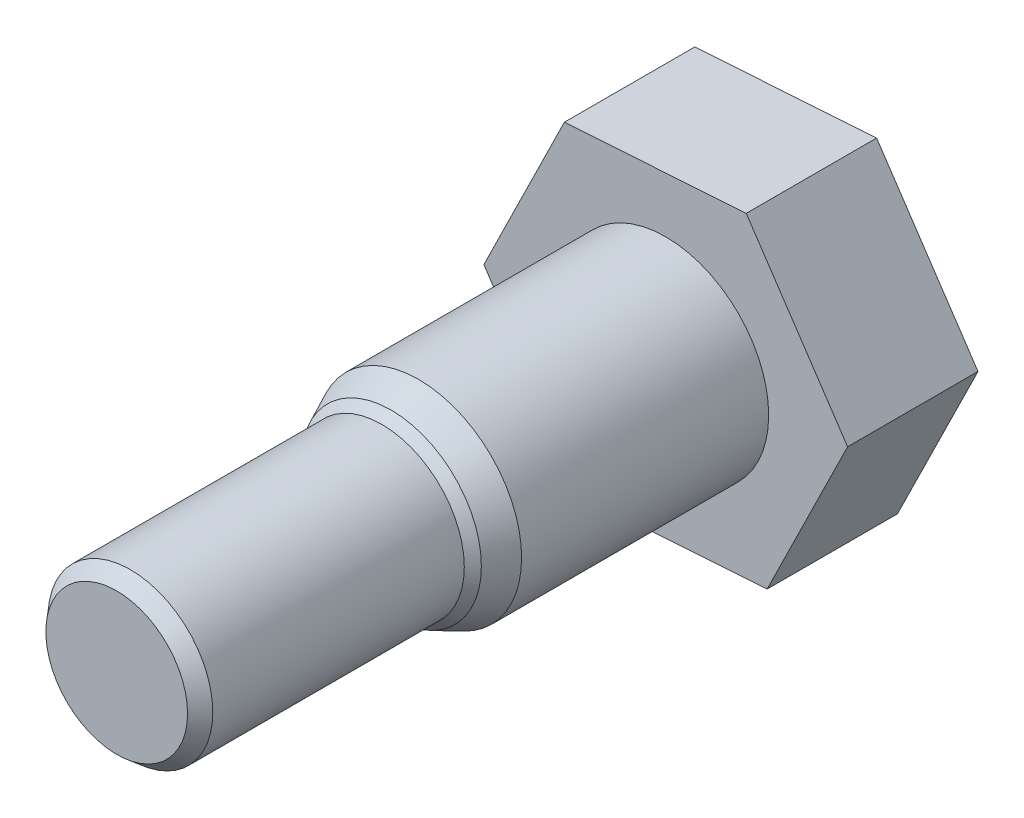
ISO-10303-21;
HEADER;
FILE_DESCRIPTION(('STEP AP214'),'2;1');
FILE_NAME('part.step','',(''),(''),'','','');
FILE_SCHEMA(('AUTOMOTIVE_DESIGN { 1 0 10303 214 1 1 1 1 }'));
ENDSEC;
DATA;
#1=APPLICATION_CONTEXT('core data for automotive mechanical design processes');
#2=APPLICATION_PROTOCOL_DEFINITION('international standard','automotive_design',2000,#1);
#3=PRODUCT_CONTEXT('',#1,'mechanical');
#4=PRODUCT('Part','Part','',(#3));
#5=PRODUCT_RELATED_PRODUCT_CATEGORY('part','',(#4));
#6=PRODUCT_DEFINITION_FORMATION('','',#4);
#7=PRODUCT_DEFINITION_CONTEXT('part definition',#1,'design');
#8=PRODUCT_DEFINITION('design','',#6,#7);
#9=PRODUCT_DEFINITION_SHAPE('','',#8);
#10=(LENGTH_UNIT() NAMED_UNIT(*) SI_UNIT(.MILLI.,.METRE.));
#11=(NAMED_UNIT(*) PLANE_ANGLE_UNIT() SI_UNIT($,.RADIAN.));
#12=(NAMED_UNIT(*) SI_UNIT($,.STERADIAN.) SOLID_ANGLE_UNIT());
#13=UNCERTAINTY_MEASURE_WITH_UNIT(LENGTH_MEASURE(1.E-05),#10,'distance_accuracy_value','');
#14=(GEOMETRIC_REPRESENTATION_CONTEXT(3) GLOBAL_UNCERTAINTY_ASSIGNED_CONTEXT((#13)) GLOBAL_UNIT_ASSIGNED_CONTEXT((#10,
#11,#12)) REPRESENTATION_CONTEXT('',''));
#15=CARTESIAN_POINT('',(0.,0.,0.));
#16=DIRECTION('',(0.,0.,1.));
#17=DIRECTION('',(1.,0.,0.));
#18=AXIS2_PLACEMENT_3D('',#15,#16,#17);
#19=CARTESIAN_POINT('',(14.7706906325746,-22.0717020542165,19.));
#20=DIRECTION('',(0.,0.,1.));
#21=DIRECTION('',(1.,0.,0.));
#22=AXIS2_PLACEMENT_3D('',#19,#20,#21);
#23=PLANE('',#22);
#24=DIRECTION('',(0.997811878273375,0.0661169840249835,0.));
#25=VECTOR('',#24,1.);
#26=CARTESIAN_POINT('',(-11.7293093674254,-23.8276443463587,19.));
#27=LINE('',#26,#25);
#28=CARTESIAN_POINT('',(-11.7293093674254,-23.8276443463587,19.));
#29=VERTEX_POINT('',#28);
#30=CARTESIAN_POINT('',(14.7706906325746,-22.0717020542165,19.));
#31=VERTEX_POINT('',#30);
#32=EDGE_CURVE('E129',#29,#31,#27,.T.);
#33=ORIENTED_EDGE('',*,*,#32,.T.);
#34=DIRECTION('',(0.441646951349442,0.8971889267951,0.));
#35=VECTOR('',#34,1.);
#36=CARTESIAN_POINT('',(14.7706906325746,-22.0717020542165,19.));
#37=LINE('',#36,#35);
#38=CARTESIAN_POINT('',(26.5,1.7559422921422,19.));
#39=VERTEX_POINT('',#38);
#40=EDGE_CURVE('E87',#31,#39,#37,.T.);
#41=ORIENTED_EDGE('',*,*,#40,.T.);
#42=DIRECTION('',(-0.556164926923933,0.831071942770117,0.));
#43=VECTOR('',#42,1.);
#44=CARTESIAN_POINT('',(26.5,1.7559422921422,19.));
#45=LINE('',#44,#43);
#46=CARTESIAN_POINT('',(11.7293093674254,23.8276443463587,19.));
#47=VERTEX_POINT('',#46);
#48=EDGE_CURVE('E100',#39,#47,#45,.T.);
#49=ORIENTED_EDGE('',*,*,#48,.T.);
#50=DIRECTION('',(-0.997811878273375,-0.0661169840249832,0.));
#51=VECTOR('',#50,1.);
#52=CARTESIAN_POINT('',(11.7293093674254,23.8276443463587,19.));
#53=LINE('',#52,#51);
#54=CARTESIAN_POINT('',(-14.7706906325746,22.0717020542165,19.));
#55=VERTEX_POINT('',#54);
#56=EDGE_CURVE('E94',#47,#55,#53,.T.);
#57=ORIENTED_EDGE('',*,*,#56,.T.);
#58=DIRECTION('',(-0.441646951349442,-0.8971889267951,0.));
#59=VECTOR('',#58,1.);
#60=CARTESIAN_POINT('',(-14.7706906325746,22.0717020542165,19.));
#61=LINE('',#60,#59);
#62=CARTESIAN_POINT('',(-26.5,-1.75594229214218,19.));
#63=VERTEX_POINT('',#62);
#64=EDGE_CURVE('E98',#55,#63,#61,.T.);
#65=ORIENTED_EDGE('',*,*,#64,.T.);
#66=DIRECTION('',(0.556164926923933,-0.831071942770117,0.));
#67=VECTOR('',#66,1.);
#68=CARTESIAN_POINT('',(-26.5,-1.75594229214218,19.));
#69=LINE('',#68,#67);
#70=EDGE_CURVE('E49',#63,#29,#69,.T.);
#71=ORIENTED_EDGE('',*,*,#70,.T.);
#72=EDGE_LOOP('',(#33,#41,#49,#57,#65,#71));
#73=FACE_BOUND('',#72,.T.);
#74=CARTESIAN_POINT('',(0.,0.,19.));
#75=DIRECTION('',(0.,0.,1.));
#76=DIRECTION('',(1.,0.,0.));
#77=AXIS2_PLACEMENT_3D('',#74,#75,#76);
#78=CIRCLE('',#77,15.);
#79=CARTESIAN_POINT('',(15.,0.,19.));
#80=VERTEX_POINT('',#79);
#81=EDGE_CURVE('E148',#80,#80,#78,.T.);
#82=ORIENTED_EDGE('',*,*,#81,.F.);
#83=EDGE_LOOP('',(#82));
#84=FACE_BOUND('',#83,.T.);
#85=ADVANCED_FACE('F32',(#73,#84),#23,.T.);
#86=CARTESIAN_POINT('',(-11.7293093674254,-23.8276443463587,19.));
#87=DIRECTION('',(-0.0661169840249835,0.997811878273375,0.));
#88=DIRECTION('',(-0.997811878273375,-0.0661169840249835,0.));
#89=AXIS2_PLACEMENT_3D('',#86,#87,#88);
#90=PLANE('',#89);
#91=DIRECTION('',(0.997811878273375,0.0661169840249835,0.));
#92=VECTOR('',#91,1.);
#93=CARTESIAN_POINT('',(-11.7293093674254,-23.8276443463587,0.));
#94=LINE('',#93,#92);
#95=CARTESIAN_POINT('',(-11.7293093674254,-23.8276443463587,0.));
#96=VERTEX_POINT('',#95);
#97=CARTESIAN_POINT('',(14.7706906325746,-22.0717020542165,0.));
#98=VERTEX_POINT('',#97);
#99=EDGE_CURVE('E118',#96,#98,#94,.T.);
#100=ORIENTED_EDGE('',*,*,#99,.T.);
#101=DIRECTION('',(0.,0.,-1.));
#102=VECTOR('',#101,1.);
#103=CARTESIAN_POINT('',(14.7706906325746,-22.0717020542165,19.));
#104=LINE('',#103,#102);
#105=EDGE_CURVE('E41',#31,#98,#104,.T.);
#106=ORIENTED_EDGE('',*,*,#105,.F.);
#107=ORIENTED_EDGE('',*,*,#32,.F.);
#108=DIRECTION('',(0.,0.,-1.));
#109=VECTOR('',#108,1.);
#110=CARTESIAN_POINT('',(-11.7293093674254,-23.8276443463587,19.));
#111=LINE('',#110,#109);
#112=EDGE_CURVE('E114',#29,#96,#111,.T.);
#113=ORIENTED_EDGE('',*,*,#112,.T.);
#114=EDGE_LOOP('',(#100,#106,#107,#113));
#115=FACE_BOUND('',#114,.T.);
#116=ADVANCED_FACE('F140',(#115),#90,.F.);
#117=CARTESIAN_POINT('',(14.7706906325746,-22.0717020542165,19.));
#118=DIRECTION('',(-0.8971889267951,0.441646951349442,0.));
#119=DIRECTION('',(-0.441646951349442,-0.8971889267951,0.));
#120=AXIS2_PLACEMENT_3D('',#117,#118,#119);
#121=PLANE('',#120);
#122=DIRECTION('',(0.441646951349442,0.8971889267951,0.));
#123=VECTOR('',#122,1.);
#124=CARTESIAN_POINT('',(14.7706906325746,-22.0717020542165,0.));
#125=LINE('',#124,#123);
#126=CARTESIAN_POINT('',(26.5,1.7559422921422,0.));
#127=VERTEX_POINT('',#126);
#128=EDGE_CURVE('E121',#98,#127,#125,.T.);
#129=ORIENTED_EDGE('',*,*,#128,.T.);
#130=DIRECTION('',(0.,0.,-1.));
#131=VECTOR('',#130,1.);
#132=CARTESIAN_POINT('',(26.5,1.7559422921422,19.));
#133=LINE('',#132,#131);
#134=EDGE_CURVE('E133',#39,#127,#133,.T.);
#135=ORIENTED_EDGE('',*,*,#134,.F.);
#136=ORIENTED_EDGE('',*,*,#40,.F.);
#137=ORIENTED_EDGE('',*,*,#105,.T.);
#138=EDGE_LOOP('',(#129,#135,#136,#137));
#139=FACE_BOUND('',#138,.T.);
#140=ADVANCED_FACE('F136',(#139),#121,.F.);
#141=CARTESIAN_POINT('',(26.5,1.7559422921422,19.));
#142=DIRECTION('',(-0.831071942770117,-0.556164926923933,0.));
#143=DIRECTION('',(0.556164926923933,-0.831071942770117,0.));
#144=AXIS2_PLACEMENT_3D('',#141,#142,#143);
#145=PLANE('',#144);
#146=DIRECTION('',(-0.556164926923933,0.831071942770117,0.));
#147=VECTOR('',#146,1.);
#148=CARTESIAN_POINT('',(26.5,1.7559422921422,0.));
#149=LINE('',#148,#147);
#150=CARTESIAN_POINT('',(11.7293093674254,23.8276443463587,0.));
#151=VERTEX_POINT('',#150);
#152=EDGE_CURVE('E124',#127,#151,#149,.T.);
#153=ORIENTED_EDGE('',*,*,#152,.T.);
#154=DIRECTION('',(0.,0.,-1.));
#155=VECTOR('',#154,1.);
#156=CARTESIAN_POINT('',(11.7293093674254,23.8276443463587,19.));
#157=LINE('',#156,#155);
#158=EDGE_CURVE('E109',#47,#151,#157,.T.);
#159=ORIENTED_EDGE('',*,*,#158,.F.);
#160=ORIENTED_EDGE('',*,*,#48,.F.);
#161=ORIENTED_EDGE('',*,*,#134,.T.);
#162=EDGE_LOOP('',(#153,#159,#160,#161));
#163=FACE_BOUND('',#162,.T.);
#164=ADVANCED_FACE('F144',(#163),#145,.F.);
#165=CARTESIAN_POINT('',(11.7293093674254,23.8276443463587,19.));
#166=DIRECTION('',(0.0661169840249832,-0.997811878273375,0.));
#167=DIRECTION('',(0.997811878273375,0.0661169840249832,0.));
#168=AXIS2_PLACEMENT_3D('',#165,#166,#167);
#169=PLANE('',#168);
#170=DIRECTION('',(-0.997811878273375,-0.0661169840249832,0.));
#171=VECTOR('',#170,1.);
#172=CARTESIAN_POINT('',(11.7293093674254,23.8276443463587,0.));
#173=LINE('',#172,#171);
#174=CARTESIAN_POINT('',(-14.7706906325746,22.0717020542165,0.));
#175=VERTEX_POINT('',#174);
#176=EDGE_CURVE('E108',#151,#175,#173,.T.);
#177=ORIENTED_EDGE('',*,*,#176,.T.);
#178=DIRECTION('',(0.,0.,-1.));
#179=VECTOR('',#178,1.);
#180=CARTESIAN_POINT('',(-14.7706906325746,22.0717020542165,19.));
#181=LINE('',#180,#179);
#182=EDGE_CURVE('E105',#55,#175,#181,.T.);
#183=ORIENTED_EDGE('',*,*,#182,.F.);
#184=ORIENTED_EDGE('',*,*,#56,.F.);
#185=ORIENTED_EDGE('',*,*,#158,.T.);
#186=EDGE_LOOP('',(#177,#183,#184,#185));
#187=FACE_BOUND('',#186,.T.);
#188=ADVANCED_FACE('F106',(#187),#169,.F.);
#189=CARTESIAN_POINT('',(-14.7706906325746,22.0717020542165,19.));
#190=DIRECTION('',(0.8971889267951,-0.441646951349442,0.));
#191=DIRECTION('',(0.441646951349442,0.8971889267951,0.));
#192=AXIS2_PLACEMENT_3D('',#189,#190,#191);
#193=PLANE('',#192);
#194=DIRECTION('',(-0.441646951349442,-0.8971889267951,0.));
#195=VECTOR('',#194,1.);
#196=CARTESIAN_POINT('',(-14.7706906325746,22.0717020542165,0.));
#197=LINE('',#196,#195);
#198=CARTESIAN_POINT('',(-26.5,-1.75594229214218,0.));
#199=VERTEX_POINT('',#198);
#200=EDGE_CURVE('E72',#175,#199,#197,.T.);
#201=ORIENTED_EDGE('',*,*,#200,.T.);
#202=DIRECTION('',(0.,0.,-1.));
#203=VECTOR('',#202,1.);
#204=CARTESIAN_POINT('',(-26.5,-1.75594229214218,19.));
#205=LINE('',#204,#203);
#206=EDGE_CURVE('E110',#63,#199,#205,.T.);
#207=ORIENTED_EDGE('',*,*,#206,.F.);
#208=ORIENTED_EDGE('',*,*,#64,.F.);
#209=ORIENTED_EDGE('',*,*,#182,.T.);
#210=EDGE_LOOP('',(#201,#207,#208,#209));
#211=FACE_BOUND('',#210,.T.);
#212=ADVANCED_FACE('F112',(#211),#193,.F.);
#213=CARTESIAN_POINT('',(-26.5,-1.75594229214218,19.));
#214=DIRECTION('',(0.831071942770117,0.556164926923933,0.));
#215=DIRECTION('',(-0.556164926923933,0.831071942770117,0.));
#216=AXIS2_PLACEMENT_3D('',#213,#214,#215);
#217=PLANE('',#216);
#218=DIRECTION('',(0.556164926923933,-0.831071942770117,0.));
#219=VECTOR('',#218,1.);
#220=CARTESIAN_POINT('',(-26.5,-1.75594229214218,0.));
#221=LINE('',#220,#219);
#222=EDGE_CURVE('E78',#199,#96,#221,.T.);
#223=ORIENTED_EDGE('',*,*,#222,.T.);
#224=ORIENTED_EDGE('',*,*,#112,.F.);
#225=ORIENTED_EDGE('',*,*,#70,.F.);
#226=ORIENTED_EDGE('',*,*,#206,.T.);
#227=EDGE_LOOP('',(#223,#224,#225,#226));
#228=FACE_BOUND('',#227,.T.);
#229=ADVANCED_FACE('F195',(#228),#217,.F.);
#230=CARTESIAN_POINT('',(0.,0.,0.));
#231=DIRECTION('',(0.,0.,1.));
#232=DIRECTION('',(1.,0.,0.));
#233=AXIS2_PLACEMENT_3D('',#230,#231,#232);
#234=PLANE('',#233);
#235=ORIENTED_EDGE('',*,*,#99,.F.);
#236=ORIENTED_EDGE('',*,*,#222,.F.);
#237=ORIENTED_EDGE('',*,*,#200,.F.);
#238=ORIENTED_EDGE('',*,*,#176,.F.);
#239=ORIENTED_EDGE('',*,*,#152,.F.);
#240=ORIENTED_EDGE('',*,*,#128,.F.);
#241=EDGE_LOOP('',(#235,#236,#237,#238,#239,#240));
#242=FACE_BOUND('',#241,.T.);
#243=ADVANCED_FACE('F34',(#242),#234,.F.);
#244=CARTESIAN_POINT('',(0.,0.,55.));
#245=DIRECTION('',(0.,0.,-1.));
#246=DIRECTION('',(-1.,0.,0.));
#247=AXIS2_PLACEMENT_3D('',#244,#245,#246);
#248=CYLINDRICAL_SURFACE('',#247,15.);
#249=CARTESIAN_POINT('',(0.,0.,55.));
#250=DIRECTION('',(0.,0.,1.));
#251=DIRECTION('',(1.,0.,0.));
#252=AXIS2_PLACEMENT_3D('',#249,#250,#251);
#253=CIRCLE('',#252,15.);
#254=CARTESIAN_POINT('',(15.,0.,55.));
#255=VERTEX_POINT('',#254);
#256=EDGE_CURVE('E122',#255,#255,#253,.T.);
#257=ORIENTED_EDGE('',*,*,#256,.F.);
#258=EDGE_LOOP('',(#257));
#259=FACE_BOUND('',#258,.T.);
#260=ORIENTED_EDGE('',*,*,#81,.T.);
#261=EDGE_LOOP('',(#260));
#262=FACE_BOUND('',#261,.T.);
#263=ADVANCED_FACE('F185',(#259,#262),#248,.T.);
#264=CARTESIAN_POINT('',(0.,0.,55.));
#265=DIRECTION('',(0.,0.,-1.));
#266=DIRECTION('',(1.,0.,0.));
#267=AXIS2_PLACEMENT_3D('',#264,#265,#266);
#268=CONICAL_SURFACE('',#267,15.,0.436332312998583);
#269=CARTESIAN_POINT('',(0.,0.,59.));
#270=DIRECTION('',(0.,0.,1.));
#271=DIRECTION('',(1.,0.,0.));
#272=AXIS2_PLACEMENT_3D('',#269,#270,#271);
#273=CIRCLE('',#272,13.13476936738);
#274=CARTESIAN_POINT('',(13.13476936738,0.,59.));
#275=VERTEX_POINT('',#274);
#276=EDGE_CURVE('E151',#275,#275,#273,.T.);
#277=ORIENTED_EDGE('',*,*,#276,.F.);
#278=EDGE_LOOP('',(#277));
#279=FACE_BOUND('',#278,.T.);
#280=ORIENTED_EDGE('',*,*,#256,.T.);
#281=EDGE_LOOP('',(#280));
#282=FACE_BOUND('',#281,.T.);
#283=ADVANCED_FACE('F179',(#279,#282),#268,.T.);
#284=CARTESIAN_POINT('',(0.,0.,59.));
#285=DIRECTION('',(0.,0.,-1.));
#286=DIRECTION('',(1.,0.,0.));
#287=AXIS2_PLACEMENT_3D('',#284,#285,#286);
#288=CONICAL_SURFACE('',#287,13.13476936738,0.698131700797733);
#289=ORIENTED_EDGE('',*,*,#276,.T.);
#290=EDGE_LOOP('',(#289));
#291=FACE_BOUND('',#290,.T.);
#292=CARTESIAN_POINT('',(0.,0.,60.352365470341));
#293=DIRECTION('',(0.,0.,-1.));
#294=DIRECTION('',(-1.,0.,0.));
#295=AXIS2_PLACEMENT_3D('',#292,#293,#294);
#296=CIRCLE('',#295,12.);
#297=CARTESIAN_POINT('',(-12.,0.,60.352365470341));
#298=VERTEX_POINT('',#297);
#299=EDGE_CURVE('E11',#298,#298,#296,.T.);
#300=ORIENTED_EDGE('',*,*,#299,.T.);
#301=EDGE_LOOP('',(#300));
#302=FACE_BOUND('',#301,.T.);
#303=ADVANCED_FACE('F174',(#291,#302),#288,.T.);
#304=CARTESIAN_POINT('',(0.,0.,97.));
#305=DIRECTION('',(0.,0.,-1.));
#306=DIRECTION('',(-1.,0.,0.));
#307=AXIS2_PLACEMENT_3D('',#304,#305,#306);
#308=CYLINDRICAL_SURFACE('',#307,12.);
#309=CARTESIAN_POINT('',(0.,0.,97.));
#310=DIRECTION('',(0.,0.,1.));
#311=DIRECTION('',(1.,0.,0.));
#312=AXIS2_PLACEMENT_3D('',#309,#310,#311);
#313=CIRCLE('',#312,12.);
#314=CARTESIAN_POINT('',(12.,0.,97.));
#315=VERTEX_POINT('',#314);
#316=EDGE_CURVE('E156',#315,#315,#313,.T.);
#317=ORIENTED_EDGE('',*,*,#316,.F.);
#318=EDGE_LOOP('',(#317));
#319=FACE_BOUND('',#318,.T.);
#320=ORIENTED_EDGE('',*,*,#299,.F.);
#321=EDGE_LOOP('',(#320));
#322=FACE_BOUND('',#321,.T.);
#323=ADVANCED_FACE('F168',(#319,#322),#308,.T.);
#324=CARTESIAN_POINT('',(0.,0.,97.));
#325=DIRECTION('',(0.,0.,-1.));
#326=DIRECTION('',(1.,0.,0.));
#327=AXIS2_PLACEMENT_3D('',#324,#325,#326);
#328=CONICAL_SURFACE('',#327,12.,0.698131700797733);
#329=CARTESIAN_POINT('',(0.,0.,99.));
#330=DIRECTION('',(0.,0.,1.));
#331=DIRECTION('',(1.,0.,0.));
#332=AXIS2_PLACEMENT_3D('',#329,#330,#331);
#333=CIRCLE('',#332,10.3218007376454);
#334=CARTESIAN_POINT('',(10.3218007376454,0.,99.));
#335=VERTEX_POINT('',#334);
#336=EDGE_CURVE('E159',#335,#335,#333,.T.);
#337=ORIENTED_EDGE('',*,*,#336,.F.);
#338=EDGE_LOOP('',(#337));
#339=FACE_BOUND('',#338,.T.);
#340=ORIENTED_EDGE('',*,*,#316,.T.);
#341=EDGE_LOOP('',(#340));
#342=FACE_BOUND('',#341,.T.);
#343=ADVANCED_FACE('F165',(#339,#342),#328,.T.);
#344=CARTESIAN_POINT('',(0.,0.,99.));
#345=DIRECTION('',(0.,0.,1.));
#346=DIRECTION('',(1.,0.,0.));
#347=AXIS2_PLACEMENT_3D('',#344,#345,#346);
#348=PLANE('',#347);
#349=ORIENTED_EDGE('',*,*,#336,.T.);
#350=EDGE_LOOP('',(#349));
#351=FACE_BOUND('',#350,.T.);
#352=ADVANCED_FACE('F163',(#351),#348,.T.);
#353=CLOSED_SHELL('',(#85,#116,#140,#164,#188,#212,#229,#243,#263,#283,#303,#323,#343,#352));
#354=MANIFOLD_SOLID_BREP('B2',#353);
#355=ADVANCED_BREP_SHAPE_REPRESENTATION('',(#18,#354),#14);
#356=SHAPE_DEFINITION_REPRESENTATION(#9,#355);
ENDSEC;
END-ISO-10303-21;
